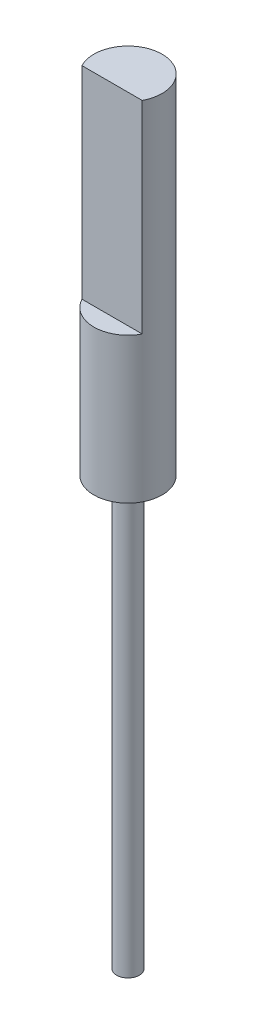
ISO-10303-21;
HEADER;
FILE_DESCRIPTION(('STEP AP214'),'2;1');
FILE_NAME('part.step','',(''),(''),'','','');
FILE_SCHEMA(('AUTOMOTIVE_DESIGN { 1 0 10303 214 1 1 1 1 }'));
ENDSEC;
DATA;
#1=APPLICATION_CONTEXT('core data for automotive mechanical design processes');
#2=APPLICATION_PROTOCOL_DEFINITION('international standard','automotive_design',2000,#1);
#3=PRODUCT_CONTEXT('',#1,'mechanical');
#4=PRODUCT('Part','Part','',(#3));
#5=PRODUCT_RELATED_PRODUCT_CATEGORY('part','',(#4));
#6=PRODUCT_DEFINITION_FORMATION('','',#4);
#7=PRODUCT_DEFINITION_CONTEXT('part definition',#1,'design');
#8=PRODUCT_DEFINITION('design','',#6,#7);
#9=PRODUCT_DEFINITION_SHAPE('','',#8);
#10=(LENGTH_UNIT() NAMED_UNIT(*) SI_UNIT(.MILLI.,.METRE.));
#11=(NAMED_UNIT(*) PLANE_ANGLE_UNIT() SI_UNIT($,.RADIAN.));
#12=(NAMED_UNIT(*) SI_UNIT($,.STERADIAN.) SOLID_ANGLE_UNIT());
#13=UNCERTAINTY_MEASURE_WITH_UNIT(LENGTH_MEASURE(1.E-05),#10,'distance_accuracy_value','');
#14=(GEOMETRIC_REPRESENTATION_CONTEXT(3) GLOBAL_UNCERTAINTY_ASSIGNED_CONTEXT((#13)) GLOBAL_UNIT_ASSIGNED_CONTEXT((#10,
#11,#12)) REPRESENTATION_CONTEXT('',''));
#15=CARTESIAN_POINT('',(0.,0.,0.));
#16=DIRECTION('',(0.,0.,1.));
#17=DIRECTION('',(1.,0.,0.));
#18=AXIS2_PLACEMENT_3D('',#15,#16,#17);
#19=CARTESIAN_POINT('',(0.,18.8,0.));
#20=DIRECTION('',(0.,-1.,0.));
#21=DIRECTION('',(0.,0.,-1.));
#22=AXIS2_PLACEMENT_3D('',#19,#20,#21);
#23=CYLINDRICAL_SURFACE('',#22,0.5);
#24=CARTESIAN_POINT('',(0.,18.8,0.));
#25=DIRECTION('',(0.,1.,0.));
#26=DIRECTION('',(0.,0.,1.));
#27=AXIS2_PLACEMENT_3D('',#24,#25,#26);
#28=CIRCLE('',#27,0.5);
#29=CARTESIAN_POINT('',(0.,18.8,0.5));
#30=VERTEX_POINT('',#29);
#31=EDGE_CURVE('E11',#30,#30,#28,.T.);
#32=ORIENTED_EDGE('',*,*,#31,.F.);
#33=EDGE_LOOP('',(#32));
#34=FACE_BOUND('',#33,.T.);
#35=CARTESIAN_POINT('',(0.,0.,0.));
#36=DIRECTION('',(0.,1.,0.));
#37=DIRECTION('',(0.,0.,1.));
#38=AXIS2_PLACEMENT_3D('',#35,#36,#37);
#39=CIRCLE('',#38,0.5);
#40=CARTESIAN_POINT('',(0.,0.,0.5));
#41=VERTEX_POINT('',#40);
#42=EDGE_CURVE('E46',#41,#41,#39,.T.);
#43=ORIENTED_EDGE('',*,*,#42,.T.);
#44=EDGE_LOOP('',(#43));
#45=FACE_BOUND('',#44,.T.);
#46=ADVANCED_FACE('F43',(#34,#45),#23,.T.);
#47=CARTESIAN_POINT('',(0.,0.,0.));
#48=DIRECTION('',(0.,1.,0.));
#49=DIRECTION('',(0.,0.,1.));
#50=AXIS2_PLACEMENT_3D('',#47,#48,#49);
#51=PLANE('',#50);
#52=ORIENTED_EDGE('',*,*,#42,.F.);
#53=EDGE_LOOP('',(#52));
#54=FACE_BOUND('',#53,.T.);
#55=ADVANCED_FACE('F110',(#54),#51,.F.);
#56=CARTESIAN_POINT('',(0.,34.1,0.));
#57=DIRECTION('',(0.,-1.,0.));
#58=DIRECTION('',(0.,0.,-1.));
#59=AXIS2_PLACEMENT_3D('',#56,#57,#58);
#60=CYLINDRICAL_SURFACE('',#59,1.5);
#61=CARTESIAN_POINT('',(0.,34.1,0.));
#62=DIRECTION('',(0.,1.,0.));
#63=DIRECTION('',(0.,0.,1.));
#64=AXIS2_PLACEMENT_3D('',#61,#62,#63);
#65=CIRCLE('',#64,1.5);
#66=CARTESIAN_POINT('',(1.32664991614216,34.1,0.7));
#67=VERTEX_POINT('',#66);
#68=CARTESIAN_POINT('',(-1.32664991614216,34.1,0.7));
#69=VERTEX_POINT('',#68);
#70=EDGE_CURVE('E81',#67,#69,#65,.T.);
#71=ORIENTED_EDGE('',*,*,#70,.F.);
#72=DIRECTION('',(0.,1.,0.));
#73=VECTOR('',#72,1.);
#74=CARTESIAN_POINT('',(1.32664991614216,25.2,0.7));
#75=LINE('',#74,#73);
#76=CARTESIAN_POINT('',(1.32664991614216,25.2,0.7));
#77=VERTEX_POINT('',#76);
#78=EDGE_CURVE('E58',#77,#67,#75,.T.);
#79=ORIENTED_EDGE('',*,*,#78,.F.);
#80=CARTESIAN_POINT('',(0.,25.2,0.));
#81=DIRECTION('',(0.,1.,0.));
#82=DIRECTION('',(0.,0.,1.));
#83=AXIS2_PLACEMENT_3D('',#80,#81,#82);
#84=CIRCLE('',#83,1.5);
#85=CARTESIAN_POINT('',(-1.32664991614216,25.2,0.7));
#86=VERTEX_POINT('',#85);
#87=EDGE_CURVE('E75',#86,#77,#84,.T.);
#88=ORIENTED_EDGE('',*,*,#87,.F.);
#89=DIRECTION('',(0.,1.,0.));
#90=VECTOR('',#89,1.);
#91=CARTESIAN_POINT('',(-1.32664991614216,25.2,0.7));
#92=LINE('',#91,#90);
#93=EDGE_CURVE('E64',#86,#69,#92,.T.);
#94=ORIENTED_EDGE('',*,*,#93,.T.);
#95=EDGE_LOOP('',(#71,#79,#88,#94));
#96=FACE_BOUND('',#95,.T.);
#97=CARTESIAN_POINT('',(0.,18.8,0.));
#98=DIRECTION('',(0.,1.,0.));
#99=DIRECTION('',(0.,0.,1.));
#100=AXIS2_PLACEMENT_3D('',#97,#98,#99);
#101=CIRCLE('',#100,1.5);
#102=CARTESIAN_POINT('',(0.,18.8,1.5));
#103=VERTEX_POINT('',#102);
#104=EDGE_CURVE('E83',#103,#103,#101,.T.);
#105=ORIENTED_EDGE('',*,*,#104,.T.);
#106=EDGE_LOOP('',(#105));
#107=FACE_BOUND('',#106,.T.);
#108=ADVANCED_FACE('F79',(#96,#107),#60,.T.);
#109=CARTESIAN_POINT('',(0.,34.1,0.));
#110=DIRECTION('',(0.,1.,0.));
#111=DIRECTION('',(0.,0.,1.));
#112=AXIS2_PLACEMENT_3D('',#109,#110,#111);
#113=PLANE('',#112);
#114=DIRECTION('',(-1.,0.,0.));
#115=VECTOR('',#114,1.);
#116=CARTESIAN_POINT('',(-1.32664991614216,34.1,0.7));
#117=LINE('',#116,#115);
#118=EDGE_CURVE('E69',#67,#69,#117,.T.);
#119=ORIENTED_EDGE('',*,*,#118,.F.);
#120=ORIENTED_EDGE('',*,*,#70,.T.);
#121=EDGE_LOOP('',(#119,#120));
#122=FACE_BOUND('',#121,.T.);
#123=ADVANCED_FACE('F85',(#122),#113,.T.);
#124=CARTESIAN_POINT('',(0.,18.8,0.));
#125=DIRECTION('',(0.,1.,0.));
#126=DIRECTION('',(0.,0.,1.));
#127=AXIS2_PLACEMENT_3D('',#124,#125,#126);
#128=PLANE('',#127);
#129=ORIENTED_EDGE('',*,*,#31,.T.);
#130=EDGE_LOOP('',(#129));
#131=FACE_BOUND('',#130,.T.);
#132=ORIENTED_EDGE('',*,*,#104,.F.);
#133=EDGE_LOOP('',(#132));
#134=FACE_BOUND('',#133,.T.);
#135=ADVANCED_FACE('F107',(#131,#134),#128,.F.);
#136=CARTESIAN_POINT('',(-1.32664991614216,25.2,0.7));
#137=DIRECTION('',(0.,0.,-1.));
#138=DIRECTION('',(-1.,0.,0.));
#139=AXIS2_PLACEMENT_3D('',#136,#137,#138);
#140=PLANE('',#139);
#141=ORIENTED_EDGE('',*,*,#118,.T.);
#142=ORIENTED_EDGE('',*,*,#93,.F.);
#143=DIRECTION('',(-1.,0.,0.));
#144=VECTOR('',#143,1.);
#145=CARTESIAN_POINT('',(-1.32664991614216,25.2,0.7));
#146=LINE('',#145,#144);
#147=EDGE_CURVE('E95',#77,#86,#146,.T.);
#148=ORIENTED_EDGE('',*,*,#147,.F.);
#149=ORIENTED_EDGE('',*,*,#78,.T.);
#150=EDGE_LOOP('',(#141,#142,#148,#149));
#151=FACE_BOUND('',#150,.T.);
#152=ADVANCED_FACE('F70',(#151),#140,.F.);
#153=CARTESIAN_POINT('',(0.,25.2,0.));
#154=DIRECTION('',(0.,1.,0.));
#155=DIRECTION('',(0.,0.,1.));
#156=AXIS2_PLACEMENT_3D('',#153,#154,#155);
#157=PLANE('',#156);
#158=ORIENTED_EDGE('',*,*,#87,.T.);
#159=ORIENTED_EDGE('',*,*,#147,.T.);
#160=EDGE_LOOP('',(#158,#159));
#161=FACE_BOUND('',#160,.T.);
#162=ADVANCED_FACE('F101',(#161),#157,.T.);
#163=CLOSED_SHELL('',(#46,#55,#108,#123,#135,#152,#162));
#164=MANIFOLD_SOLID_BREP('B2',#163);
#165=ADVANCED_BREP_SHAPE_REPRESENTATION('',(#18,#164),#14);
#166=SHAPE_DEFINITION_REPRESENTATION(#9,#165);
ENDSEC;
END-ISO-10303-21;
